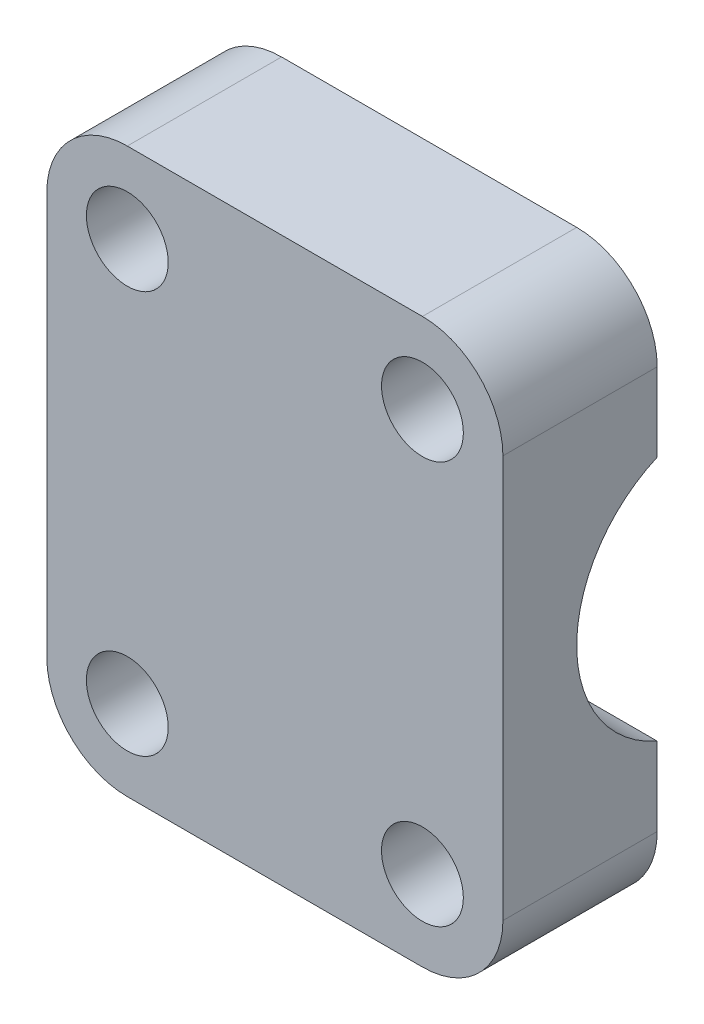
ISO-10303-21;
HEADER;
FILE_DESCRIPTION(('STEP AP214'),'2;1');
FILE_NAME('part.step','',(''),(''),'','','');
FILE_SCHEMA(('AUTOMOTIVE_DESIGN { 1 0 10303 214 1 1 1 1 }'));
ENDSEC;
DATA;
#1=APPLICATION_CONTEXT('core data for automotive mechanical design processes');
#2=APPLICATION_PROTOCOL_DEFINITION('international standard','automotive_design',2000,#1);
#3=PRODUCT_CONTEXT('',#1,'mechanical');
#4=PRODUCT('Part','Part','',(#3));
#5=PRODUCT_RELATED_PRODUCT_CATEGORY('part','',(#4));
#6=PRODUCT_DEFINITION_FORMATION('','',#4);
#7=PRODUCT_DEFINITION_CONTEXT('part definition',#1,'design');
#8=PRODUCT_DEFINITION('design','',#6,#7);
#9=PRODUCT_DEFINITION_SHAPE('','',#8);
#10=(LENGTH_UNIT() NAMED_UNIT(*) SI_UNIT(.MILLI.,.METRE.));
#11=(NAMED_UNIT(*) PLANE_ANGLE_UNIT() SI_UNIT($,.RADIAN.));
#12=(NAMED_UNIT(*) SI_UNIT($,.STERADIAN.) SOLID_ANGLE_UNIT());
#13=UNCERTAINTY_MEASURE_WITH_UNIT(LENGTH_MEASURE(1.E-05),#10,'distance_accuracy_value','');
#14=(GEOMETRIC_REPRESENTATION_CONTEXT(3) GLOBAL_UNCERTAINTY_ASSIGNED_CONTEXT((#13)) GLOBAL_UNIT_ASSIGNED_CONTEXT((#10,
#11,#12)) REPRESENTATION_CONTEXT('',''));
#15=CARTESIAN_POINT('',(0.,0.,0.));
#16=DIRECTION('',(0.,0.,1.));
#17=DIRECTION('',(1.,0.,0.));
#18=AXIS2_PLACEMENT_3D('',#15,#16,#17);
#19=CARTESIAN_POINT('',(0.,0.,2.));
#20=DIRECTION('',(0.,0.,1.));
#21=DIRECTION('',(1.,0.,0.));
#22=AXIS2_PLACEMENT_3D('',#19,#20,#21);
#23=PLANE('',#22);
#24=CARTESIAN_POINT('',(-5.5,-7.5,2.));
#25=DIRECTION('',(0.,0.,1.));
#26=DIRECTION('',(1.,0.,0.));
#27=AXIS2_PLACEMENT_3D('',#24,#25,#26);
#28=CIRCLE('',#27,1.525);
#29=CARTESIAN_POINT('',(-3.975,-7.5,2.));
#30=VERTEX_POINT('',#29);
#31=EDGE_CURVE('E142',#30,#30,#28,.T.);
#32=ORIENTED_EDGE('',*,*,#31,.T.);
#33=EDGE_LOOP('',(#32));
#34=FACE_BOUND('',#33,.T.);
#35=CARTESIAN_POINT('',(5.5,-7.5,2.));
#36=DIRECTION('',(0.,0.,1.));
#37=DIRECTION('',(1.,0.,0.));
#38=AXIS2_PLACEMENT_3D('',#35,#36,#37);
#39=CIRCLE('',#38,1.525);
#40=CARTESIAN_POINT('',(7.025,-7.5,2.));
#41=VERTEX_POINT('',#40);
#42=EDGE_CURVE('E149',#41,#41,#39,.T.);
#43=ORIENTED_EDGE('',*,*,#42,.T.);
#44=EDGE_LOOP('',(#43));
#45=FACE_BOUND('',#44,.T.);
#46=DIRECTION('',(1.,0.,0.));
#47=VECTOR('',#46,1.);
#48=CARTESIAN_POINT('',(8.5,-10.5,2.));
#49=LINE('',#48,#47);
#50=CARTESIAN_POINT('',(-5.5,-10.5,2.));
#51=VERTEX_POINT('',#50);
#52=CARTESIAN_POINT('',(5.5,-10.5,2.));
#53=VERTEX_POINT('',#52);
#54=EDGE_CURVE('E124',#51,#53,#49,.T.);
#55=ORIENTED_EDGE('',*,*,#54,.F.);
#56=CARTESIAN_POINT('',(-5.5,-7.5,2.));
#57=DIRECTION('',(0.,0.,1.));
#58=DIRECTION('',(1.,0.,0.));
#59=AXIS2_PLACEMENT_3D('',#56,#57,#58);
#60=CIRCLE('',#59,3.);
#61=CARTESIAN_POINT('',(-8.5,-7.50000000000001,2.));
#62=VERTEX_POINT('',#61);
#63=EDGE_CURVE('E194',#51,#62,#60,.F.);
#64=ORIENTED_EDGE('',*,*,#63,.T.);
#65=DIRECTION('',(0.,-1.,0.));
#66=VECTOR('',#65,1.);
#67=CARTESIAN_POINT('',(-8.5,-10.5,2.));
#68=LINE('',#67,#66);
#69=CARTESIAN_POINT('',(-8.5,-4.58257569495584,2.));
#70=VERTEX_POINT('',#69);
#71=EDGE_CURVE('E125',#70,#62,#68,.T.);
#72=ORIENTED_EDGE('',*,*,#71,.F.);
#73=DIRECTION('',(1.,0.,0.));
#74=VECTOR('',#73,1.);
#75=CARTESIAN_POINT('',(-8.5,-4.58257569495584,2.));
#76=LINE('',#75,#74);
#77=CARTESIAN_POINT('',(8.5,-4.58257569495584,2.));
#78=VERTEX_POINT('',#77);
#79=EDGE_CURVE('E133',#70,#78,#76,.T.);
#80=ORIENTED_EDGE('',*,*,#79,.T.);
#81=DIRECTION('',(0.,1.,0.));
#82=VECTOR('',#81,1.);
#83=CARTESIAN_POINT('',(8.5,-10.5,2.));
#84=LINE('',#83,#82);
#85=CARTESIAN_POINT('',(8.5,-7.50000000000001,2.));
#86=VERTEX_POINT('',#85);
#87=EDGE_CURVE('E185',#86,#78,#84,.T.);
#88=ORIENTED_EDGE('',*,*,#87,.F.);
#89=CARTESIAN_POINT('',(5.5,-7.5,2.));
#90=DIRECTION('',(0.,0.,1.));
#91=DIRECTION('',(1.,0.,0.));
#92=AXIS2_PLACEMENT_3D('',#89,#90,#91);
#93=CIRCLE('',#92,3.);
#94=EDGE_CURVE('E192',#86,#53,#93,.F.);
#95=ORIENTED_EDGE('',*,*,#94,.T.);
#96=EDGE_LOOP('',(#55,#64,#72,#80,#88,#95));
#97=FACE_BOUND('',#96,.T.);
#98=ADVANCED_FACE('F35',(#34,#45,#97),#23,.F.);
#99=CARTESIAN_POINT('',(0.,0.,7.75));
#100=DIRECTION('',(0.,0.,1.));
#101=DIRECTION('',(1.,0.,0.));
#102=AXIS2_PLACEMENT_3D('',#99,#100,#101);
#103=PLANE('',#102);
#104=CARTESIAN_POINT('',(5.5,-7.5,7.75));
#105=DIRECTION('',(0.,0.,1.));
#106=DIRECTION('',(1.,0.,0.));
#107=AXIS2_PLACEMENT_3D('',#104,#105,#106);
#108=CIRCLE('',#107,1.525);
#109=CARTESIAN_POINT('',(7.025,-7.5,7.75));
#110=VERTEX_POINT('',#109);
#111=EDGE_CURVE('E152',#110,#110,#108,.T.);
#112=ORIENTED_EDGE('',*,*,#111,.F.);
#113=EDGE_LOOP('',(#112));
#114=FACE_BOUND('',#113,.T.);
#115=CARTESIAN_POINT('',(-5.5,7.5,7.75));
#116=DIRECTION('',(0.,0.,1.));
#117=DIRECTION('',(1.,0.,0.));
#118=AXIS2_PLACEMENT_3D('',#115,#116,#117);
#119=CIRCLE('',#118,1.525);
#120=CARTESIAN_POINT('',(-3.975,7.5,7.75));
#121=VERTEX_POINT('',#120);
#122=EDGE_CURVE('E164',#121,#121,#119,.T.);
#123=ORIENTED_EDGE('',*,*,#122,.F.);
#124=EDGE_LOOP('',(#123));
#125=FACE_BOUND('',#124,.T.);
#126=DIRECTION('',(0.,-1.,0.));
#127=VECTOR('',#126,1.);
#128=CARTESIAN_POINT('',(-8.5,-10.5,7.75));
#129=LINE('',#128,#127);
#130=CARTESIAN_POINT('',(-8.5,7.49999999999999,7.75));
#131=VERTEX_POINT('',#130);
#132=CARTESIAN_POINT('',(-8.5,-7.50000000000001,7.75));
#133=VERTEX_POINT('',#132);
#134=EDGE_CURVE('E169',#131,#133,#129,.T.);
#135=ORIENTED_EDGE('',*,*,#134,.T.);
#136=CARTESIAN_POINT('',(-5.5,-7.5,7.75));
#137=DIRECTION('',(0.,0.,1.));
#138=DIRECTION('',(1.,0.,0.));
#139=AXIS2_PLACEMENT_3D('',#136,#137,#138);
#140=CIRCLE('',#139,3.);
#141=CARTESIAN_POINT('',(-5.5,-10.5,7.75));
#142=VERTEX_POINT('',#141);
#143=EDGE_CURVE('E205',#133,#142,#140,.T.);
#144=ORIENTED_EDGE('',*,*,#143,.T.);
#145=DIRECTION('',(1.,0.,0.));
#146=VECTOR('',#145,1.);
#147=CARTESIAN_POINT('',(8.5,-10.5,7.75));
#148=LINE('',#147,#146);
#149=CARTESIAN_POINT('',(5.5,-10.5,7.75));
#150=VERTEX_POINT('',#149);
#151=EDGE_CURVE('E172',#142,#150,#148,.T.);
#152=ORIENTED_EDGE('',*,*,#151,.T.);
#153=CARTESIAN_POINT('',(5.5,-7.5,7.75));
#154=DIRECTION('',(0.,0.,1.));
#155=DIRECTION('',(1.,0.,0.));
#156=AXIS2_PLACEMENT_3D('',#153,#154,#155);
#157=CIRCLE('',#156,3.);
#158=CARTESIAN_POINT('',(8.5,-7.50000000000001,7.75));
#159=VERTEX_POINT('',#158);
#160=EDGE_CURVE('E201',#150,#159,#157,.T.);
#161=ORIENTED_EDGE('',*,*,#160,.T.);
#162=DIRECTION('',(0.,1.,0.));
#163=VECTOR('',#162,1.);
#164=CARTESIAN_POINT('',(8.5,-10.5,7.75));
#165=LINE('',#164,#163);
#166=CARTESIAN_POINT('',(8.5,7.49999999999999,7.75));
#167=VERTEX_POINT('',#166);
#168=EDGE_CURVE('E176',#159,#167,#165,.T.);
#169=ORIENTED_EDGE('',*,*,#168,.T.);
#170=CARTESIAN_POINT('',(5.5,7.5,7.75));
#171=DIRECTION('',(0.,0.,1.));
#172=DIRECTION('',(1.,0.,0.));
#173=AXIS2_PLACEMENT_3D('',#170,#171,#172);
#174=CIRCLE('',#173,3.);
#175=CARTESIAN_POINT('',(5.5,10.5,7.75));
#176=VERTEX_POINT('',#175);
#177=EDGE_CURVE('E199',#167,#176,#174,.T.);
#178=ORIENTED_EDGE('',*,*,#177,.T.);
#179=DIRECTION('',(-1.,0.,0.));
#180=VECTOR('',#179,1.);
#181=CARTESIAN_POINT('',(8.5,10.5,7.75));
#182=LINE('',#181,#180);
#183=CARTESIAN_POINT('',(-5.5,10.5,7.75));
#184=VERTEX_POINT('',#183);
#185=EDGE_CURVE('E179',#176,#184,#182,.T.);
#186=ORIENTED_EDGE('',*,*,#185,.T.);
#187=CARTESIAN_POINT('',(-5.5,7.5,7.75));
#188=DIRECTION('',(0.,0.,1.));
#189=DIRECTION('',(1.,0.,0.));
#190=AXIS2_PLACEMENT_3D('',#187,#188,#189);
#191=CIRCLE('',#190,3.);
#192=EDGE_CURVE('E203',#184,#131,#191,.T.);
#193=ORIENTED_EDGE('',*,*,#192,.T.);
#194=EDGE_LOOP('',(#135,#144,#152,#161,#169,#178,#186,#193));
#195=FACE_BOUND('',#194,.T.);
#196=CARTESIAN_POINT('',(5.5,7.5,7.75));
#197=DIRECTION('',(0.,0.,1.));
#198=DIRECTION('',(1.,0.,0.));
#199=AXIS2_PLACEMENT_3D('',#196,#197,#198);
#200=CIRCLE('',#199,1.525);
#201=CARTESIAN_POINT('',(7.025,7.5,7.75));
#202=VERTEX_POINT('',#201);
#203=EDGE_CURVE('E158',#202,#202,#200,.T.);
#204=ORIENTED_EDGE('',*,*,#203,.F.);
#205=EDGE_LOOP('',(#204));
#206=FACE_BOUND('',#205,.T.);
#207=CARTESIAN_POINT('',(-5.5,-7.5,7.75));
#208=DIRECTION('',(0.,0.,1.));
#209=DIRECTION('',(1.,0.,0.));
#210=AXIS2_PLACEMENT_3D('',#207,#208,#209);
#211=CIRCLE('',#210,1.525);
#212=CARTESIAN_POINT('',(-3.975,-7.5,7.75));
#213=VERTEX_POINT('',#212);
#214=EDGE_CURVE('E146',#213,#213,#211,.T.);
#215=ORIENTED_EDGE('',*,*,#214,.F.);
#216=EDGE_LOOP('',(#215));
#217=FACE_BOUND('',#216,.T.);
#218=ADVANCED_FACE('F218',(#114,#125,#195,#206,#217),#103,.T.);
#219=CARTESIAN_POINT('',(-8.5,7.49999999999999,2.));
#220=VERTEX_POINT('',#219);
#221=CARTESIAN_POINT('',(-8.5,4.58257569495584,2.));
#222=VERTEX_POINT('',#221);
#223=EDGE_CURVE('E114',#220,#222,#68,.T.);
#224=ORIENTED_EDGE('',*,*,#223,.F.);
#225=CARTESIAN_POINT('',(-5.5,7.5,2.));
#226=DIRECTION('',(0.,0.,1.));
#227=DIRECTION('',(1.,0.,0.));
#228=AXIS2_PLACEMENT_3D('',#225,#226,#227);
#229=CIRCLE('',#228,3.);
#230=CARTESIAN_POINT('',(-5.5,10.5,2.));
#231=VERTEX_POINT('',#230);
#232=EDGE_CURVE('E50',#220,#231,#229,.F.);
#233=ORIENTED_EDGE('',*,*,#232,.T.);
#234=DIRECTION('',(-1.,0.,0.));
#235=VECTOR('',#234,1.);
#236=CARTESIAN_POINT('',(8.5,10.5,2.));
#237=LINE('',#236,#235);
#238=CARTESIAN_POINT('',(5.5,10.5,2.));
#239=VERTEX_POINT('',#238);
#240=EDGE_CURVE('E173',#239,#231,#237,.T.);
#241=ORIENTED_EDGE('',*,*,#240,.F.);
#242=CARTESIAN_POINT('',(5.5,7.5,2.));
#243=DIRECTION('',(0.,0.,1.));
#244=DIRECTION('',(1.,0.,0.));
#245=AXIS2_PLACEMENT_3D('',#242,#243,#244);
#246=CIRCLE('',#245,3.);
#247=CARTESIAN_POINT('',(8.5,7.49999999999999,2.));
#248=VERTEX_POINT('',#247);
#249=EDGE_CURVE('E58',#239,#248,#246,.F.);
#250=ORIENTED_EDGE('',*,*,#249,.T.);
#251=CARTESIAN_POINT('',(8.5,4.58257569495584,2.));
#252=VERTEX_POINT('',#251);
#253=EDGE_CURVE('E140',#252,#248,#84,.T.);
#254=ORIENTED_EDGE('',*,*,#253,.F.);
#255=DIRECTION('',(1.,0.,0.));
#256=VECTOR('',#255,1.);
#257=CARTESIAN_POINT('',(-8.5,4.58257569495584,2.));
#258=LINE('',#257,#256);
#259=EDGE_CURVE('E130',#252,#222,#258,.F.);
#260=ORIENTED_EDGE('',*,*,#259,.T.);
#261=EDGE_LOOP('',(#224,#233,#241,#250,#254,#260));
#262=FACE_BOUND('',#261,.T.);
#263=CARTESIAN_POINT('',(-5.5,7.5,2.));
#264=DIRECTION('',(0.,0.,1.));
#265=DIRECTION('',(1.,0.,0.));
#266=AXIS2_PLACEMENT_3D('',#263,#264,#265);
#267=CIRCLE('',#266,1.525);
#268=CARTESIAN_POINT('',(-3.975,7.5,2.));
#269=VERTEX_POINT('',#268);
#270=EDGE_CURVE('E161',#269,#269,#267,.T.);
#271=ORIENTED_EDGE('',*,*,#270,.T.);
#272=EDGE_LOOP('',(#271));
#273=FACE_BOUND('',#272,.T.);
#274=CARTESIAN_POINT('',(5.5,7.5,2.));
#275=DIRECTION('',(0.,0.,1.));
#276=DIRECTION('',(1.,0.,0.));
#277=AXIS2_PLACEMENT_3D('',#274,#275,#276);
#278=CIRCLE('',#277,1.525);
#279=CARTESIAN_POINT('',(7.025,7.5,2.));
#280=VERTEX_POINT('',#279);
#281=EDGE_CURVE('E155',#280,#280,#278,.T.);
#282=ORIENTED_EDGE('',*,*,#281,.T.);
#283=EDGE_LOOP('',(#282));
#284=FACE_BOUND('',#283,.T.);
#285=ADVANCED_FACE('F137',(#262,#273,#284),#23,.F.);
#286=CARTESIAN_POINT('',(-8.5,-10.5,7.75));
#287=DIRECTION('',(1.,0.,0.));
#288=DIRECTION('',(0.,0.,-1.));
#289=AXIS2_PLACEMENT_3D('',#286,#287,#288);
#290=PLANE('',#289);
#291=ORIENTED_EDGE('',*,*,#71,.T.);
#292=DIRECTION('',(0.,0.,-1.));
#293=VECTOR('',#292,1.);
#294=CARTESIAN_POINT('',(-8.5,-7.5,7.75));
#295=LINE('',#294,#293);
#296=EDGE_CURVE('E197',#62,#133,#295,.F.);
#297=ORIENTED_EDGE('',*,*,#296,.T.);
#298=ORIENTED_EDGE('',*,*,#134,.F.);
#299=DIRECTION('',(0.,0.,-1.));
#300=VECTOR('',#299,1.);
#301=CARTESIAN_POINT('',(-8.5,7.5,7.75));
#302=LINE('',#301,#300);
#303=EDGE_CURVE('E122',#131,#220,#302,.T.);
#304=ORIENTED_EDGE('',*,*,#303,.T.);
#305=ORIENTED_EDGE('',*,*,#223,.T.);
#306=CARTESIAN_POINT('',(-8.5,0.,0.));
#307=DIRECTION('',(1.,0.,0.));
#308=DIRECTION('',(0.,0.,-1.));
#309=AXIS2_PLACEMENT_3D('',#306,#307,#308);
#310=CIRCLE('',#309,5.);
#311=EDGE_CURVE('E118',#222,#70,#310,.T.);
#312=ORIENTED_EDGE('',*,*,#311,.T.);
#313=EDGE_LOOP('',(#291,#297,#298,#304,#305,#312));
#314=FACE_BOUND('',#313,.T.);
#315=ADVANCED_FACE('F117',(#314),#290,.F.);
#316=CARTESIAN_POINT('',(8.5,-10.5,7.75));
#317=DIRECTION('',(0.,1.,0.));
#318=DIRECTION('',(0.,0.,1.));
#319=AXIS2_PLACEMENT_3D('',#316,#317,#318);
#320=PLANE('',#319);
#321=ORIENTED_EDGE('',*,*,#151,.F.);
#322=DIRECTION('',(0.,0.,-1.));
#323=VECTOR('',#322,1.);
#324=CARTESIAN_POINT('',(-5.5,-10.5,7.75));
#325=LINE('',#324,#323);
#326=EDGE_CURVE('E189',#142,#51,#325,.T.);
#327=ORIENTED_EDGE('',*,*,#326,.T.);
#328=ORIENTED_EDGE('',*,*,#54,.T.);
#329=DIRECTION('',(0.,0.,-1.));
#330=VECTOR('',#329,1.);
#331=CARTESIAN_POINT('',(5.5,-10.5,7.75));
#332=LINE('',#331,#330);
#333=EDGE_CURVE('E181',#53,#150,#332,.F.);
#334=ORIENTED_EDGE('',*,*,#333,.T.);
#335=EDGE_LOOP('',(#321,#327,#328,#334));
#336=FACE_BOUND('',#335,.T.);
#337=ADVANCED_FACE('F253',(#336),#320,.F.);
#338=CARTESIAN_POINT('',(8.5,-10.5,7.75));
#339=DIRECTION('',(-1.,0.,0.));
#340=DIRECTION('',(0.,0.,1.));
#341=AXIS2_PLACEMENT_3D('',#338,#339,#340);
#342=PLANE('',#341);
#343=ORIENTED_EDGE('',*,*,#168,.F.);
#344=DIRECTION('',(0.,0.,-1.));
#345=VECTOR('',#344,1.);
#346=CARTESIAN_POINT('',(8.5,-7.5,7.75));
#347=LINE('',#346,#345);
#348=EDGE_CURVE('E11',#159,#86,#347,.T.);
#349=ORIENTED_EDGE('',*,*,#348,.T.);
#350=ORIENTED_EDGE('',*,*,#87,.T.);
#351=CARTESIAN_POINT('',(8.5,0.,0.));
#352=DIRECTION('',(1.,0.,0.));
#353=DIRECTION('',(0.,0.,-1.));
#354=AXIS2_PLACEMENT_3D('',#351,#352,#353);
#355=CIRCLE('',#354,5.);
#356=EDGE_CURVE('E134',#252,#78,#355,.T.);
#357=ORIENTED_EDGE('',*,*,#356,.F.);
#358=ORIENTED_EDGE('',*,*,#253,.T.);
#359=DIRECTION('',(0.,0.,-1.));
#360=VECTOR('',#359,1.);
#361=CARTESIAN_POINT('',(8.5,7.5,7.75));
#362=LINE('',#361,#360);
#363=EDGE_CURVE('E43',#248,#167,#362,.F.);
#364=ORIENTED_EDGE('',*,*,#363,.T.);
#365=EDGE_LOOP('',(#343,#349,#350,#357,#358,#364));
#366=FACE_BOUND('',#365,.T.);
#367=ADVANCED_FACE('F214',(#366),#342,.F.);
#368=CARTESIAN_POINT('',(8.5,10.5,7.75));
#369=DIRECTION('',(0.,-1.,0.));
#370=DIRECTION('',(0.,0.,-1.));
#371=AXIS2_PLACEMENT_3D('',#368,#369,#370);
#372=PLANE('',#371);
#373=ORIENTED_EDGE('',*,*,#240,.T.);
#374=DIRECTION('',(0.,0.,-1.));
#375=VECTOR('',#374,1.);
#376=CARTESIAN_POINT('',(-5.5,10.5,7.75));
#377=LINE('',#376,#375);
#378=EDGE_CURVE('E211',#231,#184,#377,.F.);
#379=ORIENTED_EDGE('',*,*,#378,.T.);
#380=ORIENTED_EDGE('',*,*,#185,.F.);
#381=DIRECTION('',(0.,0.,-1.));
#382=VECTOR('',#381,1.);
#383=CARTESIAN_POINT('',(5.5,10.5,7.75));
#384=LINE('',#383,#382);
#385=EDGE_CURVE('E209',#176,#239,#384,.T.);
#386=ORIENTED_EDGE('',*,*,#385,.T.);
#387=EDGE_LOOP('',(#373,#379,#380,#386));
#388=FACE_BOUND('',#387,.T.);
#389=ADVANCED_FACE('F223',(#388),#372,.F.);
#390=CARTESIAN_POINT('',(-5.5,7.5,7.75));
#391=DIRECTION('',(0.,0.,-1.));
#392=DIRECTION('',(-1.,0.,0.));
#393=AXIS2_PLACEMENT_3D('',#390,#391,#392);
#394=CYLINDRICAL_SURFACE('',#393,1.525);
#395=ORIENTED_EDGE('',*,*,#122,.T.);
#396=EDGE_LOOP('',(#395));
#397=FACE_BOUND('',#396,.T.);
#398=ORIENTED_EDGE('',*,*,#270,.F.);
#399=EDGE_LOOP('',(#398));
#400=FACE_BOUND('',#399,.T.);
#401=ADVANCED_FACE('F263',(#397,#400),#394,.F.);
#402=CARTESIAN_POINT('',(5.5,7.5,7.75));
#403=DIRECTION('',(0.,0.,-1.));
#404=DIRECTION('',(-1.,0.,0.));
#405=AXIS2_PLACEMENT_3D('',#402,#403,#404);
#406=CYLINDRICAL_SURFACE('',#405,1.525);
#407=ORIENTED_EDGE('',*,*,#203,.T.);
#408=EDGE_LOOP('',(#407));
#409=FACE_BOUND('',#408,.T.);
#410=ORIENTED_EDGE('',*,*,#281,.F.);
#411=EDGE_LOOP('',(#410));
#412=FACE_BOUND('',#411,.T.);
#413=ADVANCED_FACE('F267',(#409,#412),#406,.F.);
#414=CARTESIAN_POINT('',(5.5,-7.5,7.75));
#415=DIRECTION('',(0.,0.,-1.));
#416=DIRECTION('',(-1.,0.,0.));
#417=AXIS2_PLACEMENT_3D('',#414,#415,#416);
#418=CYLINDRICAL_SURFACE('',#417,1.525);
#419=ORIENTED_EDGE('',*,*,#111,.T.);
#420=EDGE_LOOP('',(#419));
#421=FACE_BOUND('',#420,.T.);
#422=ORIENTED_EDGE('',*,*,#42,.F.);
#423=EDGE_LOOP('',(#422));
#424=FACE_BOUND('',#423,.T.);
#425=ADVANCED_FACE('F273',(#421,#424),#418,.F.);
#426=CARTESIAN_POINT('',(-5.5,-7.5,7.75));
#427=DIRECTION('',(0.,0.,-1.));
#428=DIRECTION('',(-1.,0.,0.));
#429=AXIS2_PLACEMENT_3D('',#426,#427,#428);
#430=CYLINDRICAL_SURFACE('',#429,1.525);
#431=ORIENTED_EDGE('',*,*,#214,.T.);
#432=EDGE_LOOP('',(#431));
#433=FACE_BOUND('',#432,.T.);
#434=ORIENTED_EDGE('',*,*,#31,.F.);
#435=EDGE_LOOP('',(#434));
#436=FACE_BOUND('',#435,.T.);
#437=ADVANCED_FACE('F280',(#433,#436),#430,.F.);
#438=CARTESIAN_POINT('',(-8.5,0.,0.));
#439=DIRECTION('',(1.,0.,0.));
#440=DIRECTION('',(0.,0.,-1.));
#441=AXIS2_PLACEMENT_3D('',#438,#439,#440);
#442=CYLINDRICAL_SURFACE('',#441,5.);
#443=ORIENTED_EDGE('',*,*,#311,.F.);
#444=ORIENTED_EDGE('',*,*,#259,.F.);
#445=ORIENTED_EDGE('',*,*,#356,.T.);
#446=ORIENTED_EDGE('',*,*,#79,.F.);
#447=EDGE_LOOP('',(#443,#444,#445,#446));
#448=FACE_BOUND('',#447,.T.);
#449=ADVANCED_FACE('F128',(#448),#442,.F.);
#450=CARTESIAN_POINT('',(-5.5,-7.5,7.75));
#451=DIRECTION('',(0.,0.,-1.));
#452=DIRECTION('',(-1.,0.,0.));
#453=AXIS2_PLACEMENT_3D('',#450,#451,#452);
#454=CYLINDRICAL_SURFACE('',#453,3.);
#455=ORIENTED_EDGE('',*,*,#143,.F.);
#456=ORIENTED_EDGE('',*,*,#296,.F.);
#457=ORIENTED_EDGE('',*,*,#63,.F.);
#458=ORIENTED_EDGE('',*,*,#326,.F.);
#459=EDGE_LOOP('',(#455,#456,#457,#458));
#460=FACE_BOUND('',#459,.T.);
#461=ADVANCED_FACE('F230',(#460),#454,.T.);
#462=CARTESIAN_POINT('',(-5.5,7.5,7.75));
#463=DIRECTION('',(0.,0.,-1.));
#464=DIRECTION('',(-1.,0.,0.));
#465=AXIS2_PLACEMENT_3D('',#462,#463,#464);
#466=CYLINDRICAL_SURFACE('',#465,3.);
#467=ORIENTED_EDGE('',*,*,#192,.F.);
#468=ORIENTED_EDGE('',*,*,#378,.F.);
#469=ORIENTED_EDGE('',*,*,#232,.F.);
#470=ORIENTED_EDGE('',*,*,#303,.F.);
#471=EDGE_LOOP('',(#467,#468,#469,#470));
#472=FACE_BOUND('',#471,.T.);
#473=ADVANCED_FACE('F227',(#472),#466,.T.);
#474=CARTESIAN_POINT('',(5.5,-7.5,7.75));
#475=DIRECTION('',(0.,0.,-1.));
#476=DIRECTION('',(-1.,0.,0.));
#477=AXIS2_PLACEMENT_3D('',#474,#475,#476);
#478=CYLINDRICAL_SURFACE('',#477,3.);
#479=ORIENTED_EDGE('',*,*,#160,.F.);
#480=ORIENTED_EDGE('',*,*,#333,.F.);
#481=ORIENTED_EDGE('',*,*,#94,.F.);
#482=ORIENTED_EDGE('',*,*,#348,.F.);
#483=EDGE_LOOP('',(#479,#480,#481,#482));
#484=FACE_BOUND('',#483,.T.);
#485=ADVANCED_FACE('F229',(#484),#478,.T.);
#486=CARTESIAN_POINT('',(5.5,7.5,7.75));
#487=DIRECTION('',(0.,0.,-1.));
#488=DIRECTION('',(-1.,0.,0.));
#489=AXIS2_PLACEMENT_3D('',#486,#487,#488);
#490=CYLINDRICAL_SURFACE('',#489,3.);
#491=ORIENTED_EDGE('',*,*,#177,.F.);
#492=ORIENTED_EDGE('',*,*,#363,.F.);
#493=ORIENTED_EDGE('',*,*,#249,.F.);
#494=ORIENTED_EDGE('',*,*,#385,.F.);
#495=EDGE_LOOP('',(#491,#492,#493,#494));
#496=FACE_BOUND('',#495,.T.);
#497=ADVANCED_FACE('F37',(#496),#490,.T.);
#498=CLOSED_SHELL('',(#98,#218,#285,#315,#337,#367,#389,#401,#413,#425,#437,#449,#461,#473,#485,#497));
#499=MANIFOLD_SOLID_BREP('B2',#498);
#500=ADVANCED_BREP_SHAPE_REPRESENTATION('',(#18,#499),#14);
#501=SHAPE_DEFINITION_REPRESENTATION(#9,#500);
ENDSEC;
END-ISO-10303-21;
